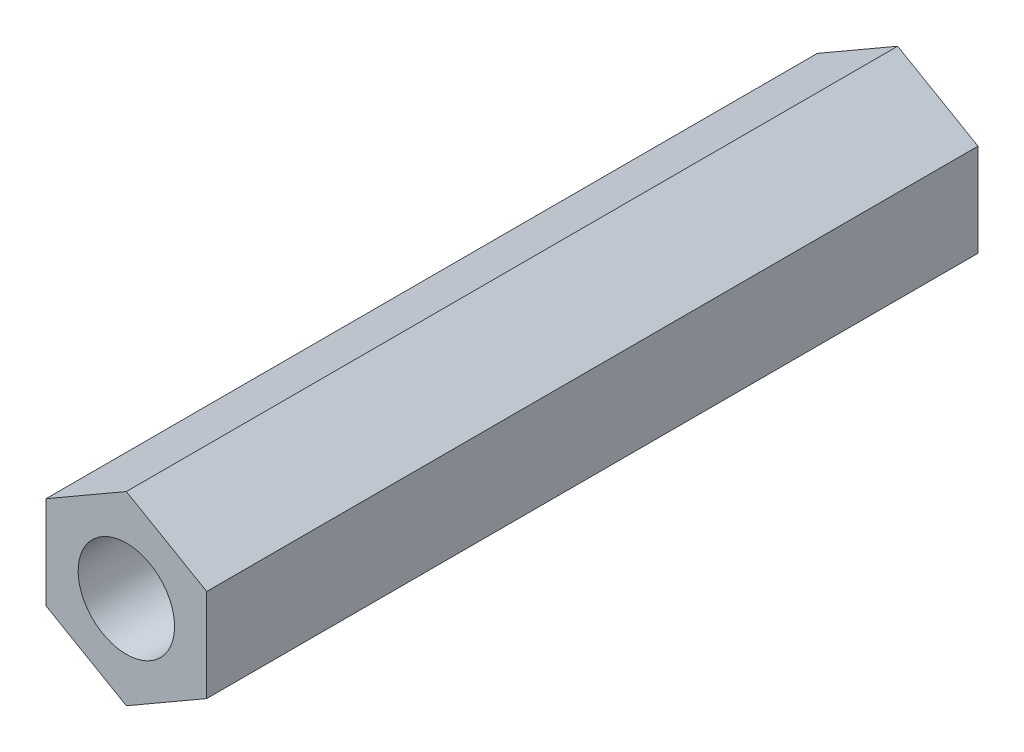
ISO-10303-21;
HEADER;
FILE_DESCRIPTION(('STEP AP214'),'2;1');
FILE_NAME('part.step','',(''),(''),'','','');
FILE_SCHEMA(('AUTOMOTIVE_DESIGN { 1 0 10303 214 1 1 1 1 }'));
ENDSEC;
DATA;
#1=APPLICATION_CONTEXT('core data for automotive mechanical design processes');
#2=APPLICATION_PROTOCOL_DEFINITION('international standard','automotive_design',2000,#1);
#3=PRODUCT_CONTEXT('',#1,'mechanical');
#4=PRODUCT('Part','Part','',(#3));
#5=PRODUCT_RELATED_PRODUCT_CATEGORY('part','',(#4));
#6=PRODUCT_DEFINITION_FORMATION('','',#4);
#7=PRODUCT_DEFINITION_CONTEXT('part definition',#1,'design');
#8=PRODUCT_DEFINITION('design','',#6,#7);
#9=PRODUCT_DEFINITION_SHAPE('','',#8);
#10=(LENGTH_UNIT() NAMED_UNIT(*) SI_UNIT(.MILLI.,.METRE.));
#11=(NAMED_UNIT(*) PLANE_ANGLE_UNIT() SI_UNIT($,.RADIAN.));
#12=(NAMED_UNIT(*) SI_UNIT($,.STERADIAN.) SOLID_ANGLE_UNIT());
#13=UNCERTAINTY_MEASURE_WITH_UNIT(LENGTH_MEASURE(1.E-05),#10,'distance_accuracy_value','');
#14=(GEOMETRIC_REPRESENTATION_CONTEXT(3) GLOBAL_UNCERTAINTY_ASSIGNED_CONTEXT((#13)) GLOBAL_UNIT_ASSIGNED_CONTEXT((#10,
#11,#12)) REPRESENTATION_CONTEXT('',''));
#15=CARTESIAN_POINT('',(0.,0.,0.));
#16=DIRECTION('',(0.,0.,1.));
#17=DIRECTION('',(1.,0.,0.));
#18=AXIS2_PLACEMENT_3D('',#15,#16,#17);
#19=CARTESIAN_POINT('',(0.,0.,24.));
#20=DIRECTION('',(0.,0.,-1.));
#21=DIRECTION('',(0.,1.,0.));
#22=AXIS2_PLACEMENT_3D('',#19,#20,#21);
#23=CYLINDRICAL_SURFACE('',#22,1.5);
#24=CARTESIAN_POINT('',(0.,0.,24.));
#25=DIRECTION('',(0.,0.,1.));
#26=DIRECTION('',(0.,1.,0.));
#27=AXIS2_PLACEMENT_3D('',#24,#25,#26);
#28=CIRCLE('',#27,1.5);
#29=CARTESIAN_POINT('',(0.,1.5,24.));
#30=VERTEX_POINT('',#29);
#31=EDGE_CURVE('E134',#30,#30,#28,.T.);
#32=ORIENTED_EDGE('',*,*,#31,.T.);
#33=DIRECTION('',(0.,0.,-1.));
#34=VECTOR('',#33,1.);
#35=CARTESIAN_POINT('',(0.,1.5,24.));
#36=LINE('',#35,#34);
#37=CARTESIAN_POINT('',(0.,1.5,0.));
#38=VERTEX_POINT('',#37);
#39=EDGE_CURVE('E10',#30,#38,#36,.T.);
#40=ORIENTED_EDGE('',*,*,#39,.T.);
#41=CARTESIAN_POINT('',(0.,0.,0.));
#42=DIRECTION('',(0.,0.,-1.));
#43=DIRECTION('',(0.,1.,0.));
#44=AXIS2_PLACEMENT_3D('',#41,#42,#43);
#45=CIRCLE('',#44,1.5);
#46=EDGE_CURVE('E142',#38,#38,#45,.T.);
#47=ORIENTED_EDGE('',*,*,#46,.T.);
#48=ORIENTED_EDGE('',*,*,#39,.F.);
#49=EDGE_LOOP('',(#32,#40,#47,#48));
#50=FACE_BOUND('',#49,.T.);
#51=ADVANCED_FACE('F16',(#50),#23,.F.);
#52=CARTESIAN_POINT('',(-2.5,0.,12.));
#53=DIRECTION('',(-1.,0.,0.));
#54=DIRECTION('',(0.,1.,0.));
#55=AXIS2_PLACEMENT_3D('',#52,#53,#54);
#56=PLANE('',#55);
#57=DIRECTION('',(0.,-1.,0.));
#58=VECTOR('',#57,1.);
#59=CARTESIAN_POINT('',(-2.5,1.4433756729738,0.));
#60=LINE('',#59,#58);
#61=CARTESIAN_POINT('',(-2.5,1.4433756729738,0.));
#62=VERTEX_POINT('',#61);
#63=CARTESIAN_POINT('',(-2.5,-1.4433756729738,0.));
#64=VERTEX_POINT('',#63);
#65=EDGE_CURVE('E175',#62,#64,#60,.T.);
#66=ORIENTED_EDGE('',*,*,#65,.T.);
#67=DIRECTION('',(0.,0.,1.));
#68=VECTOR('',#67,1.);
#69=CARTESIAN_POINT('',(-2.5,-1.4433756729738,0.));
#70=LINE('',#69,#68);
#71=CARTESIAN_POINT('',(-2.5,-1.4433756729738,24.));
#72=VERTEX_POINT('',#71);
#73=EDGE_CURVE('E138',#64,#72,#70,.T.);
#74=ORIENTED_EDGE('',*,*,#73,.T.);
#75=DIRECTION('',(0.,-1.,0.));
#76=VECTOR('',#75,1.);
#77=CARTESIAN_POINT('',(-2.5,1.4433756729738,24.));
#78=LINE('',#77,#76);
#79=CARTESIAN_POINT('',(-2.5,1.4433756729738,24.));
#80=VERTEX_POINT('',#79);
#81=EDGE_CURVE('E146',#80,#72,#78,.T.);
#82=ORIENTED_EDGE('',*,*,#81,.F.);
#83=DIRECTION('',(0.,0.,1.));
#84=VECTOR('',#83,1.);
#85=CARTESIAN_POINT('',(-2.5,1.4433756729738,0.));
#86=LINE('',#85,#84);
#87=EDGE_CURVE('E20',#62,#80,#86,.T.);
#88=ORIENTED_EDGE('',*,*,#87,.F.);
#89=EDGE_LOOP('',(#66,#74,#82,#88));
#90=FACE_BOUND('',#89,.T.);
#91=ADVANCED_FACE('F18',(#90),#56,.T.);
#92=CARTESIAN_POINT('',(-1.25,2.1650635094611,12.));
#93=DIRECTION('',(-0.500000000000151,0.866025403784352,0.));
#94=DIRECTION('',(0.,0.,1.));
#95=AXIS2_PLACEMENT_3D('',#92,#93,#94);
#96=PLANE('',#95);
#97=DIRECTION('',(-0.866025403784351,-0.500000000000151,0.));
#98=VECTOR('',#97,1.);
#99=CARTESIAN_POINT('',(0.,2.8867513459484,0.));
#100=LINE('',#99,#98);
#101=CARTESIAN_POINT('',(0.,2.8867513459484,0.));
#102=VERTEX_POINT('',#101);
#103=EDGE_CURVE('E167',#102,#62,#100,.T.);
#104=ORIENTED_EDGE('',*,*,#103,.T.);
#105=ORIENTED_EDGE('',*,*,#87,.T.);
#106=DIRECTION('',(-0.866025403784351,-0.500000000000151,0.));
#107=VECTOR('',#106,1.);
#108=CARTESIAN_POINT('',(0.,2.8867513459484,24.));
#109=LINE('',#108,#107);
#110=CARTESIAN_POINT('',(0.,2.8867513459484,24.));
#111=VERTEX_POINT('',#110);
#112=EDGE_CURVE('E120',#111,#80,#109,.T.);
#113=ORIENTED_EDGE('',*,*,#112,.F.);
#114=DIRECTION('',(0.,0.,1.));
#115=VECTOR('',#114,1.);
#116=CARTESIAN_POINT('',(0.,2.8867513459484,0.));
#117=LINE('',#116,#115);
#118=EDGE_CURVE('E112',#102,#111,#117,.T.);
#119=ORIENTED_EDGE('',*,*,#118,.F.);
#120=EDGE_LOOP('',(#104,#105,#113,#119));
#121=FACE_BOUND('',#120,.T.);
#122=ADVANCED_FACE('F163',(#121),#96,.T.);
#123=CARTESIAN_POINT('',(1.25,2.1650635094611,12.));
#124=DIRECTION('',(0.500000000000151,0.866025403784352,0.));
#125=DIRECTION('',(0.,0.,-1.));
#126=AXIS2_PLACEMENT_3D('',#123,#124,#125);
#127=PLANE('',#126);
#128=DIRECTION('',(-0.866025403784351,0.500000000000151,0.));
#129=VECTOR('',#128,1.);
#130=CARTESIAN_POINT('',(2.5,1.4433756729738,0.));
#131=LINE('',#130,#129);
#132=CARTESIAN_POINT('',(2.5,1.4433756729738,0.));
#133=VERTEX_POINT('',#132);
#134=EDGE_CURVE('E181',#133,#102,#131,.T.);
#135=ORIENTED_EDGE('',*,*,#134,.T.);
#136=ORIENTED_EDGE('',*,*,#118,.T.);
#137=DIRECTION('',(-0.866025403784351,0.500000000000151,0.));
#138=VECTOR('',#137,1.);
#139=CARTESIAN_POINT('',(2.5,1.4433756729738,24.));
#140=LINE('',#139,#138);
#141=CARTESIAN_POINT('',(2.5,1.4433756729738,24.));
#142=VERTEX_POINT('',#141);
#143=EDGE_CURVE('E111',#142,#111,#140,.T.);
#144=ORIENTED_EDGE('',*,*,#143,.F.);
#145=DIRECTION('',(0.,0.,1.));
#146=VECTOR('',#145,1.);
#147=CARTESIAN_POINT('',(2.5,1.4433756729738,0.));
#148=LINE('',#147,#146);
#149=EDGE_CURVE('E97',#133,#142,#148,.T.);
#150=ORIENTED_EDGE('',*,*,#149,.F.);
#151=EDGE_LOOP('',(#135,#136,#144,#150));
#152=FACE_BOUND('',#151,.T.);
#153=ADVANCED_FACE('F113',(#152),#127,.T.);
#154=CARTESIAN_POINT('',(2.5,0.,12.));
#155=DIRECTION('',(1.,0.,0.));
#156=DIRECTION('',(0.,1.,0.));
#157=AXIS2_PLACEMENT_3D('',#154,#155,#156);
#158=PLANE('',#157);
#159=DIRECTION('',(0.,1.,0.));
#160=VECTOR('',#159,1.);
#161=CARTESIAN_POINT('',(2.5,-1.4433756729738,0.));
#162=LINE('',#161,#160);
#163=CARTESIAN_POINT('',(2.5,-1.4433756729738,0.));
#164=VERTEX_POINT('',#163);
#165=EDGE_CURVE('E106',#164,#133,#162,.T.);
#166=ORIENTED_EDGE('',*,*,#165,.T.);
#167=ORIENTED_EDGE('',*,*,#149,.T.);
#168=DIRECTION('',(0.,1.,0.));
#169=VECTOR('',#168,1.);
#170=CARTESIAN_POINT('',(2.5,-1.4433756729738,24.));
#171=LINE('',#170,#169);
#172=CARTESIAN_POINT('',(2.5,-1.4433756729738,24.));
#173=VERTEX_POINT('',#172);
#174=EDGE_CURVE('E103',#173,#142,#171,.T.);
#175=ORIENTED_EDGE('',*,*,#174,.F.);
#176=DIRECTION('',(0.,0.,1.));
#177=VECTOR('',#176,1.);
#178=CARTESIAN_POINT('',(2.5,-1.4433756729738,0.));
#179=LINE('',#178,#177);
#180=EDGE_CURVE('E95',#164,#173,#179,.T.);
#181=ORIENTED_EDGE('',*,*,#180,.F.);
#182=EDGE_LOOP('',(#166,#167,#175,#181));
#183=FACE_BOUND('',#182,.T.);
#184=ADVANCED_FACE('F101',(#183),#158,.T.);
#185=CARTESIAN_POINT('',(1.25,-2.1650635094611,12.));
#186=DIRECTION('',(0.500000000000151,-0.866025403784352,0.));
#187=DIRECTION('',(0.,0.,-1.));
#188=AXIS2_PLACEMENT_3D('',#185,#186,#187);
#189=PLANE('',#188);
#190=DIRECTION('',(0.866025403784351,0.500000000000151,0.));
#191=VECTOR('',#190,1.);
#192=CARTESIAN_POINT('',(0.,-2.8867513459484,0.));
#193=LINE('',#192,#191);
#194=CARTESIAN_POINT('',(0.,-2.8867513459484,0.));
#195=VERTEX_POINT('',#194);
#196=EDGE_CURVE('E141',#195,#164,#193,.T.);
#197=ORIENTED_EDGE('',*,*,#196,.T.);
#198=ORIENTED_EDGE('',*,*,#180,.T.);
#199=DIRECTION('',(0.866025403784351,0.500000000000151,0.));
#200=VECTOR('',#199,1.);
#201=CARTESIAN_POINT('',(0.,-2.8867513459484,24.));
#202=LINE('',#201,#200);
#203=CARTESIAN_POINT('',(0.,-2.8867513459484,24.));
#204=VERTEX_POINT('',#203);
#205=EDGE_CURVE('E122',#204,#173,#202,.T.);
#206=ORIENTED_EDGE('',*,*,#205,.F.);
#207=DIRECTION('',(0.,0.,1.));
#208=VECTOR('',#207,1.);
#209=CARTESIAN_POINT('',(0.,-2.8867513459484,0.));
#210=LINE('',#209,#208);
#211=EDGE_CURVE('E82',#195,#204,#210,.T.);
#212=ORIENTED_EDGE('',*,*,#211,.F.);
#213=EDGE_LOOP('',(#197,#198,#206,#212));
#214=FACE_BOUND('',#213,.T.);
#215=ADVANCED_FACE('F210',(#214),#189,.T.);
#216=CARTESIAN_POINT('',(-1.25,-2.1650635094611,12.));
#217=DIRECTION('',(-0.500000000000158,-0.866025403784347,0.));
#218=DIRECTION('',(-0.866025403784347,0.500000000000158,0.));
#219=AXIS2_PLACEMENT_3D('',#216,#217,#218);
#220=PLANE('',#219);
#221=DIRECTION('',(0.866025403784347,-0.500000000000158,0.));
#222=VECTOR('',#221,1.);
#223=CARTESIAN_POINT('',(-2.5,-1.4433756729738,0.));
#224=LINE('',#223,#222);
#225=EDGE_CURVE('E137',#64,#195,#224,.T.);
#226=ORIENTED_EDGE('',*,*,#225,.T.);
#227=ORIENTED_EDGE('',*,*,#211,.T.);
#228=DIRECTION('',(0.866025403784347,-0.500000000000158,0.));
#229=VECTOR('',#228,1.);
#230=CARTESIAN_POINT('',(-2.5,-1.4433756729738,24.));
#231=LINE('',#230,#229);
#232=EDGE_CURVE('E131',#72,#204,#231,.T.);
#233=ORIENTED_EDGE('',*,*,#232,.F.);
#234=ORIENTED_EDGE('',*,*,#73,.F.);
#235=EDGE_LOOP('',(#226,#227,#233,#234));
#236=FACE_BOUND('',#235,.T.);
#237=ADVANCED_FACE('F168',(#236),#220,.T.);
#238=CARTESIAN_POINT('',(0.38675134594843,0.,24.));
#239=DIRECTION('',(0.,0.,1.));
#240=DIRECTION('',(1.,0.,0.));
#241=AXIS2_PLACEMENT_3D('',#238,#239,#240);
#242=PLANE('',#241);
#243=ORIENTED_EDGE('',*,*,#31,.F.);
#244=EDGE_LOOP('',(#243));
#245=FACE_BOUND('',#244,.T.);
#246=ORIENTED_EDGE('',*,*,#232,.T.);
#247=ORIENTED_EDGE('',*,*,#205,.T.);
#248=ORIENTED_EDGE('',*,*,#174,.T.);
#249=ORIENTED_EDGE('',*,*,#143,.T.);
#250=ORIENTED_EDGE('',*,*,#112,.T.);
#251=ORIENTED_EDGE('',*,*,#81,.T.);
#252=EDGE_LOOP('',(#246,#247,#248,#249,#250,#251));
#253=FACE_BOUND('',#252,.T.);
#254=ADVANCED_FACE('F123',(#245,#253),#242,.T.);
#255=CARTESIAN_POINT('',(0.38675134594843,0.,0.));
#256=DIRECTION('',(0.,0.,1.));
#257=DIRECTION('',(1.,0.,0.));
#258=AXIS2_PLACEMENT_3D('',#255,#256,#257);
#259=PLANE('',#258);
#260=ORIENTED_EDGE('',*,*,#46,.F.);
#261=EDGE_LOOP('',(#260));
#262=FACE_BOUND('',#261,.T.);
#263=ORIENTED_EDGE('',*,*,#65,.F.);
#264=ORIENTED_EDGE('',*,*,#103,.F.);
#265=ORIENTED_EDGE('',*,*,#134,.F.);
#266=ORIENTED_EDGE('',*,*,#165,.F.);
#267=ORIENTED_EDGE('',*,*,#196,.F.);
#268=ORIENTED_EDGE('',*,*,#225,.F.);
#269=EDGE_LOOP('',(#263,#264,#265,#266,#267,#268));
#270=FACE_BOUND('',#269,.T.);
#271=ADVANCED_FACE('F173',(#262,#270),#259,.F.);
#272=CLOSED_SHELL('',(#51,#91,#122,#153,#184,#215,#237,#254,#271));
#273=MANIFOLD_SOLID_BREP('B1',#272);
#274=ADVANCED_BREP_SHAPE_REPRESENTATION('',(#18,#273),#14);
#275=SHAPE_DEFINITION_REPRESENTATION(#9,#274);
ENDSEC;
END-ISO-10303-21;
